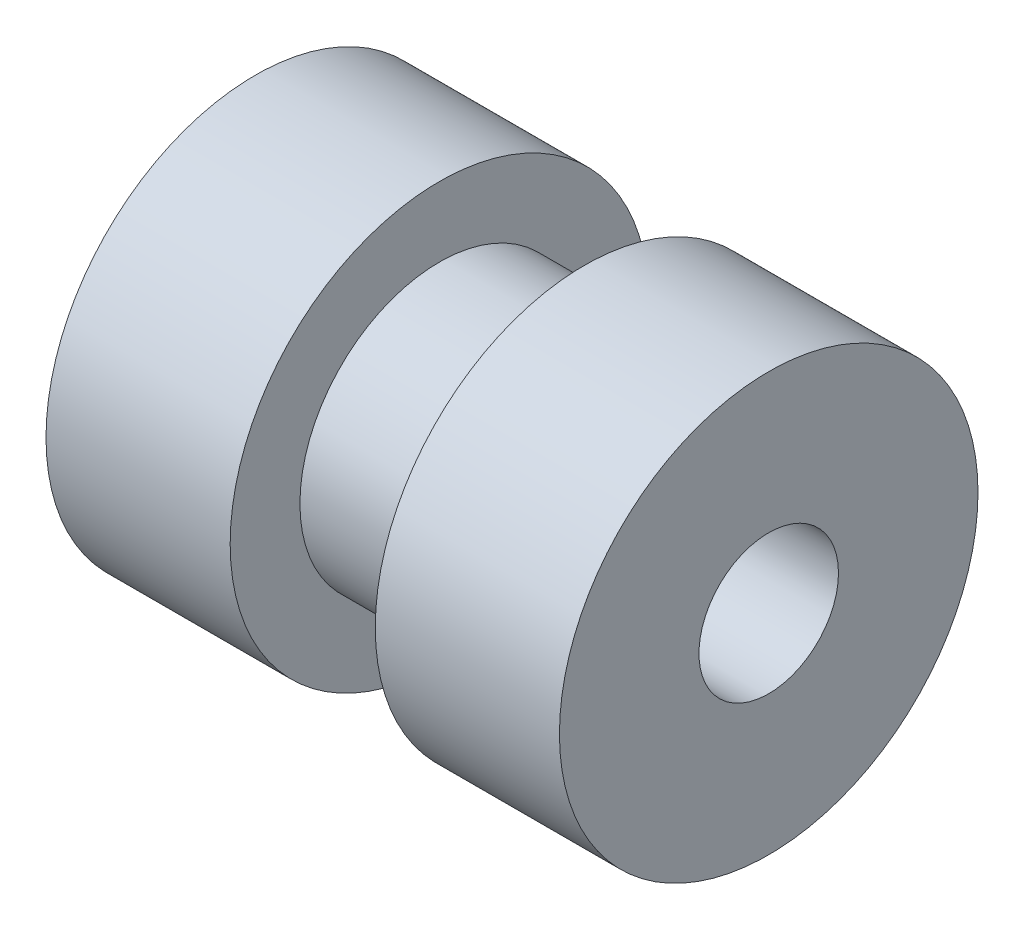
ISO-10303-21;
HEADER;
FILE_DESCRIPTION(('STEP AP214'),'2;1');
FILE_NAME('part.step','',(''),(''),'','','');
FILE_SCHEMA(('AUTOMOTIVE_DESIGN { 1 0 10303 214 1 1 1 1 }'));
ENDSEC;
DATA;
#1=APPLICATION_CONTEXT('core data for automotive mechanical design processes');
#2=APPLICATION_PROTOCOL_DEFINITION('international standard','automotive_design',2000,#1);
#3=PRODUCT_CONTEXT('',#1,'mechanical');
#4=PRODUCT('Part','Part','',(#3));
#5=PRODUCT_RELATED_PRODUCT_CATEGORY('part','',(#4));
#6=PRODUCT_DEFINITION_FORMATION('','',#4);
#7=PRODUCT_DEFINITION_CONTEXT('part definition',#1,'design');
#8=PRODUCT_DEFINITION('design','',#6,#7);
#9=PRODUCT_DEFINITION_SHAPE('','',#8);
#10=(LENGTH_UNIT() NAMED_UNIT(*) SI_UNIT(.MILLI.,.METRE.));
#11=(NAMED_UNIT(*) PLANE_ANGLE_UNIT() SI_UNIT($,.RADIAN.));
#12=(NAMED_UNIT(*) SI_UNIT($,.STERADIAN.) SOLID_ANGLE_UNIT());
#13=UNCERTAINTY_MEASURE_WITH_UNIT(LENGTH_MEASURE(1.E-05),#10,'distance_accuracy_value','');
#14=(GEOMETRIC_REPRESENTATION_CONTEXT(3) GLOBAL_UNCERTAINTY_ASSIGNED_CONTEXT((#13)) GLOBAL_UNIT_ASSIGNED_CONTEXT((#10,
#11,#12)) REPRESENTATION_CONTEXT('',''));
#15=CARTESIAN_POINT('',(0.,0.,0.));
#16=DIRECTION('',(0.,0.,1.));
#17=DIRECTION('',(1.,0.,0.));
#18=AXIS2_PLACEMENT_3D('',#15,#16,#17);
#19=CARTESIAN_POINT('',(8.382,0.,0.));
#20=DIRECTION('',(1.,0.,0.));
#21=DIRECTION('',(0.,0.,-1.));
#22=AXIS2_PLACEMENT_3D('',#19,#20,#21);
#23=PLANE('',#22);
#24=CARTESIAN_POINT('',(8.382,0.,0.));
#25=DIRECTION('',(1.,0.,0.));
#26=DIRECTION('',(0.,0.,-1.));
#27=AXIS2_PLACEMENT_3D('',#24,#25,#26);
#28=CIRCLE('',#27,9.525);
#29=CARTESIAN_POINT('',(8.382,0.,-9.525));
#30=VERTEX_POINT('',#29);
#31=EDGE_CURVE('E10',#30,#30,#28,.T.);
#32=ORIENTED_EDGE('',*,*,#31,.T.);
#33=EDGE_LOOP('',(#32));
#34=FACE_BOUND('',#33,.T.);
#35=CARTESIAN_POINT('',(8.382,0.,0.));
#36=DIRECTION('',(1.,0.,0.));
#37=DIRECTION('',(0.,0.,-1.));
#38=AXIS2_PLACEMENT_3D('',#35,#36,#37);
#39=CIRCLE('',#38,6.35);
#40=CARTESIAN_POINT('',(8.382,0.,6.35));
#41=VERTEX_POINT('',#40);
#42=EDGE_CURVE('E51',#41,#41,#39,.T.);
#43=ORIENTED_EDGE('',*,*,#42,.F.);
#44=EDGE_LOOP('',(#43));
#45=FACE_BOUND('',#44,.T.);
#46=ADVANCED_FACE('F35',(#34,#45),#23,.T.);
#47=CARTESIAN_POINT('',(0.,0.,0.));
#48=DIRECTION('',(1.,0.,0.));
#49=DIRECTION('',(0.,0.,-1.));
#50=AXIS2_PLACEMENT_3D('',#47,#48,#49);
#51=PLANE('',#50);
#52=CARTESIAN_POINT('',(0.,0.,0.));
#53=DIRECTION('',(1.,0.,0.));
#54=DIRECTION('',(0.,0.,-1.));
#55=AXIS2_PLACEMENT_3D('',#52,#53,#54);
#56=CIRCLE('',#55,9.525);
#57=CARTESIAN_POINT('',(0.,0.,-9.525));
#58=VERTEX_POINT('',#57);
#59=EDGE_CURVE('E39',#58,#58,#56,.T.);
#60=ORIENTED_EDGE('',*,*,#59,.F.);
#61=EDGE_LOOP('',(#60));
#62=FACE_BOUND('',#61,.T.);
#63=CARTESIAN_POINT('',(0.,0.,0.));
#64=DIRECTION('',(1.,0.,0.));
#65=DIRECTION('',(0.,0.,-1.));
#66=AXIS2_PLACEMENT_3D('',#63,#64,#65);
#67=CIRCLE('',#66,3.175);
#68=CARTESIAN_POINT('',(0.,0.,-3.175));
#69=VERTEX_POINT('',#68);
#70=EDGE_CURVE('E46',#69,#69,#67,.T.);
#71=ORIENTED_EDGE('',*,*,#70,.T.);
#72=EDGE_LOOP('',(#71));
#73=FACE_BOUND('',#72,.T.);
#74=ADVANCED_FACE('F84',(#62,#73),#51,.F.);
#75=CARTESIAN_POINT('',(8.382,0.,0.));
#76=DIRECTION('',(-1.,0.,0.));
#77=DIRECTION('',(0.,0.,1.));
#78=AXIS2_PLACEMENT_3D('',#75,#76,#77);
#79=CYLINDRICAL_SURFACE('',#78,9.525);
#80=ORIENTED_EDGE('',*,*,#31,.F.);
#81=EDGE_LOOP('',(#80));
#82=FACE_BOUND('',#81,.T.);
#83=ORIENTED_EDGE('',*,*,#59,.T.);
#84=EDGE_LOOP('',(#83));
#85=FACE_BOUND('',#84,.T.);
#86=ADVANCED_FACE('F37',(#82,#85),#79,.T.);
#87=CARTESIAN_POINT('',(8.382,0.,0.));
#88=DIRECTION('',(-1.,0.,0.));
#89=DIRECTION('',(0.,0.,1.));
#90=AXIS2_PLACEMENT_3D('',#87,#88,#89);
#91=CYLINDRICAL_SURFACE('',#90,3.175);
#92=ORIENTED_EDGE('',*,*,#70,.F.);
#93=EDGE_LOOP('',(#92));
#94=FACE_BOUND('',#93,.T.);
#95=CARTESIAN_POINT('',(23.368,0.,0.));
#96=DIRECTION('',(1.,0.,0.));
#97=DIRECTION('',(0.,0.,-1.));
#98=AXIS2_PLACEMENT_3D('',#95,#96,#97);
#99=CIRCLE('',#98,3.175);
#100=CARTESIAN_POINT('',(23.368,0.,-3.175));
#101=VERTEX_POINT('',#100);
#102=EDGE_CURVE('E60',#101,#101,#99,.T.);
#103=ORIENTED_EDGE('',*,*,#102,.T.);
#104=EDGE_LOOP('',(#103));
#105=FACE_BOUND('',#104,.T.);
#106=ADVANCED_FACE('F66',(#94,#105),#91,.F.);
#107=CARTESIAN_POINT('',(14.986,0.,0.));
#108=DIRECTION('',(-1.,0.,0.));
#109=DIRECTION('',(0.,0.,1.));
#110=AXIS2_PLACEMENT_3D('',#107,#108,#109);
#111=CYLINDRICAL_SURFACE('',#110,6.35);
#112=CARTESIAN_POINT('',(14.986,0.,0.));
#113=DIRECTION('',(1.,0.,0.));
#114=DIRECTION('',(0.,0.,-1.));
#115=AXIS2_PLACEMENT_3D('',#112,#113,#114);
#116=CIRCLE('',#115,6.35);
#117=CARTESIAN_POINT('',(14.986,0.,6.35));
#118=VERTEX_POINT('',#117);
#119=EDGE_CURVE('E50',#118,#118,#116,.T.);
#120=CARTESIAN_POINT('',(14.986,0.,6.35));
#121=CARTESIAN_POINT('',(14.9172083333333,0.,6.35));
#122=CARTESIAN_POINT('',(14.8484166666667,0.,6.35));
#123=CARTESIAN_POINT('',(14.7108333333333,0.,6.35));
#124=CARTESIAN_POINT('',(14.6420416666667,0.,6.35));
#125=CARTESIAN_POINT('',(14.5044583333333,0.,6.35));
#126=CARTESIAN_POINT('',(14.4356666666667,0.,6.35));
#127=CARTESIAN_POINT('',(14.2980833333333,0.,6.35));
#128=CARTESIAN_POINT('',(14.2292916666667,0.,6.35));
#129=CARTESIAN_POINT('',(14.0917083333333,0.,6.35));
#130=CARTESIAN_POINT('',(14.0229166666667,0.,6.35));
#131=CARTESIAN_POINT('',(13.8853333333333,0.,6.35));
#132=CARTESIAN_POINT('',(13.8165416666667,0.,6.35));
#133=CARTESIAN_POINT('',(13.6789583333333,0.,6.35));
#134=CARTESIAN_POINT('',(13.6101666666667,0.,6.35));
#135=CARTESIAN_POINT('',(13.4725833333333,0.,6.35));
#136=CARTESIAN_POINT('',(13.4037916666667,0.,6.35));
#137=CARTESIAN_POINT('',(13.2662083333333,0.,6.35));
#138=CARTESIAN_POINT('',(13.1974166666667,0.,6.35));
#139=CARTESIAN_POINT('',(13.0598333333333,0.,6.35));
#140=CARTESIAN_POINT('',(12.9910416666667,0.,6.35));
#141=CARTESIAN_POINT('',(12.8534583333333,0.,6.35));
#142=CARTESIAN_POINT('',(12.7846666666667,0.,6.35));
#143=CARTESIAN_POINT('',(12.6470833333333,0.,6.35));
#144=CARTESIAN_POINT('',(12.5782916666667,0.,6.35));
#145=CARTESIAN_POINT('',(12.4407083333333,0.,6.35));
#146=CARTESIAN_POINT('',(12.3719166666667,0.,6.35));
#147=CARTESIAN_POINT('',(12.2343333333333,0.,6.35));
#148=CARTESIAN_POINT('',(12.1655416666667,0.,6.35));
#149=CARTESIAN_POINT('',(12.0279583333333,0.,6.35));
#150=CARTESIAN_POINT('',(11.9591666666667,0.,6.35));
#151=CARTESIAN_POINT('',(11.8215833333333,0.,6.35));
#152=CARTESIAN_POINT('',(11.7527916666667,0.,6.35));
#153=CARTESIAN_POINT('',(11.6152083333333,0.,6.35));
#154=CARTESIAN_POINT('',(11.5464166666667,0.,6.35));
#155=CARTESIAN_POINT('',(11.4088333333333,0.,6.35));
#156=CARTESIAN_POINT('',(11.3400416666667,0.,6.35));
#157=CARTESIAN_POINT('',(11.2024583333333,0.,6.35));
#158=CARTESIAN_POINT('',(11.1336666666667,0.,6.35));
#159=CARTESIAN_POINT('',(10.9960833333333,0.,6.35));
#160=CARTESIAN_POINT('',(10.9272916666667,0.,6.35));
#161=CARTESIAN_POINT('',(10.7897083333333,0.,6.35));
#162=CARTESIAN_POINT('',(10.7209166666667,0.,6.35));
#163=CARTESIAN_POINT('',(10.5833333333333,0.,6.35));
#164=CARTESIAN_POINT('',(10.5145416666667,0.,6.35));
#165=CARTESIAN_POINT('',(10.3769583333333,0.,6.35));
#166=CARTESIAN_POINT('',(10.3081666666667,0.,6.35));
#167=CARTESIAN_POINT('',(10.1705833333333,0.,6.35));
#168=CARTESIAN_POINT('',(10.1017916666667,0.,6.35));
#169=CARTESIAN_POINT('',(9.96420833333333,0.,6.35));
#170=CARTESIAN_POINT('',(9.89541666666667,0.,6.35));
#171=CARTESIAN_POINT('',(9.75783333333333,0.,6.35));
#172=CARTESIAN_POINT('',(9.68904166666667,0.,6.35));
#173=CARTESIAN_POINT('',(9.55145833333333,0.,6.35));
#174=CARTESIAN_POINT('',(9.48266666666667,0.,6.35));
#175=CARTESIAN_POINT('',(9.34508333333333,0.,6.35));
#176=CARTESIAN_POINT('',(9.27629166666667,0.,6.35));
#177=CARTESIAN_POINT('',(9.13870833333333,0.,6.35));
#178=CARTESIAN_POINT('',(9.06991666666667,0.,6.35));
#179=CARTESIAN_POINT('',(8.93233333333333,0.,6.35));
#180=CARTESIAN_POINT('',(8.86354166666667,0.,6.35));
#181=CARTESIAN_POINT('',(8.72595833333333,0.,6.35));
#182=CARTESIAN_POINT('',(8.65716666666667,0.,6.35));
#183=CARTESIAN_POINT('',(8.51958333333333,0.,6.35));
#184=CARTESIAN_POINT('',(8.45079166666667,0.,6.35));
#185=CARTESIAN_POINT('',(8.382,0.,6.35));
#186=B_SPLINE_CURVE_WITH_KNOTS('',3,(#120,#121,#122,#123,#124,#125,#126,#127,#128,#129,#130,
#131,#132,#133,#134,#135,#136,#137,#138,#139,#140,#141,#142,#143,#144,#145,#146,#147,#148,#149,
#150,#151,#152,#153,#154,#155,#156,#157,#158,#159,#160,#161,#162,#163,#164,#165,#166,#167,#168,
#169,#170,#171,#172,#173,#174,#175,#176,#177,#178,#179,#180,#181,#182,#183,#184,#185),
.UNSPECIFIED.,.F.,.F.,(4,2,2,2,2,2,2,2,2,2,2,2,2,2,2,2,2,2,2,2,2,2,2,2,2,2,2,2,2,2,2,2,4),(0.,
0.206375,0.412749999999998,0.619125,0.825499999999998,1.031875,1.23825,1.444625,1.651,1.857375,
2.06375,2.270125,2.4765,2.682875,2.88925,3.095625,3.302,3.508375,3.71475,3.921125,4.1275,
4.333875,4.54025,4.746625,4.953,5.159375,5.36575,5.572125,5.7785,5.984875,6.19125,6.397625,
6.604),.UNSPECIFIED.);
#187=EDGE_CURVE('BSEAM80',#118,#41,#186,.T.);
#188=ORIENTED_EDGE('',*,*,#119,.F.);
#189=ORIENTED_EDGE('',*,*,#42,.T.);
#190=ORIENTED_EDGE('',*,*,#187,.T.);
#191=ORIENTED_EDGE('',*,*,#187,.F.);
#192=EDGE_LOOP('',(#188,#190,#189,#191));
#193=FACE_BOUND('',#192,.T.);
#194=ADVANCED_FACE('F80',(#193),#111,.T.);
#195=CARTESIAN_POINT('',(14.986,0.,0.));
#196=DIRECTION('',(1.,0.,0.));
#197=DIRECTION('',(0.,0.,-1.));
#198=AXIS2_PLACEMENT_3D('',#195,#196,#197);
#199=PLANE('',#198);
#200=CARTESIAN_POINT('',(14.986,0.,0.));
#201=DIRECTION('',(1.,0.,0.));
#202=DIRECTION('',(0.,0.,-1.));
#203=AXIS2_PLACEMENT_3D('',#200,#201,#202);
#204=CIRCLE('',#203,9.525);
#205=CARTESIAN_POINT('',(14.986,0.,-9.525));
#206=VERTEX_POINT('',#205);
#207=EDGE_CURVE('E57',#206,#206,#204,.T.);
#208=ORIENTED_EDGE('',*,*,#207,.F.);
#209=EDGE_LOOP('',(#208));
#210=FACE_BOUND('',#209,.T.);
#211=ORIENTED_EDGE('',*,*,#119,.T.);
#212=EDGE_LOOP('',(#211));
#213=FACE_BOUND('',#212,.T.);
#214=ADVANCED_FACE('F71',(#210,#213),#199,.F.);
#215=CARTESIAN_POINT('',(23.368,0.,0.));
#216=DIRECTION('',(1.,0.,0.));
#217=DIRECTION('',(0.,0.,-1.));
#218=AXIS2_PLACEMENT_3D('',#215,#216,#217);
#219=PLANE('',#218);
#220=CARTESIAN_POINT('',(23.368,0.,0.));
#221=DIRECTION('',(1.,0.,0.));
#222=DIRECTION('',(0.,0.,-1.));
#223=AXIS2_PLACEMENT_3D('',#220,#221,#222);
#224=CIRCLE('',#223,9.525);
#225=CARTESIAN_POINT('',(23.368,0.,-9.525));
#226=VERTEX_POINT('',#225);
#227=EDGE_CURVE('E54',#226,#226,#224,.T.);
#228=ORIENTED_EDGE('',*,*,#227,.T.);
#229=EDGE_LOOP('',(#228));
#230=FACE_BOUND('',#229,.T.);
#231=ORIENTED_EDGE('',*,*,#102,.F.);
#232=EDGE_LOOP('',(#231));
#233=FACE_BOUND('',#232,.T.);
#234=ADVANCED_FACE('F68',(#230,#233),#219,.T.);
#235=CARTESIAN_POINT('',(23.368,0.,0.));
#236=DIRECTION('',(-1.,0.,0.));
#237=DIRECTION('',(0.,0.,1.));
#238=AXIS2_PLACEMENT_3D('',#235,#236,#237);
#239=CYLINDRICAL_SURFACE('',#238,9.525);
#240=ORIENTED_EDGE('',*,*,#227,.F.);
#241=EDGE_LOOP('',(#240));
#242=FACE_BOUND('',#241,.T.);
#243=ORIENTED_EDGE('',*,*,#207,.T.);
#244=EDGE_LOOP('',(#243));
#245=FACE_BOUND('',#244,.T.);
#246=ADVANCED_FACE('F70',(#242,#245),#239,.T.);
#247=CLOSED_SHELL('',(#46,#74,#86,#106,#194,#214,#234,#246));
#248=MANIFOLD_SOLID_BREP('B2',#247);
#249=ADVANCED_BREP_SHAPE_REPRESENTATION('',(#18,#248),#14);
#250=SHAPE_DEFINITION_REPRESENTATION(#9,#249);
ENDSEC;
END-ISO-10303-21;
